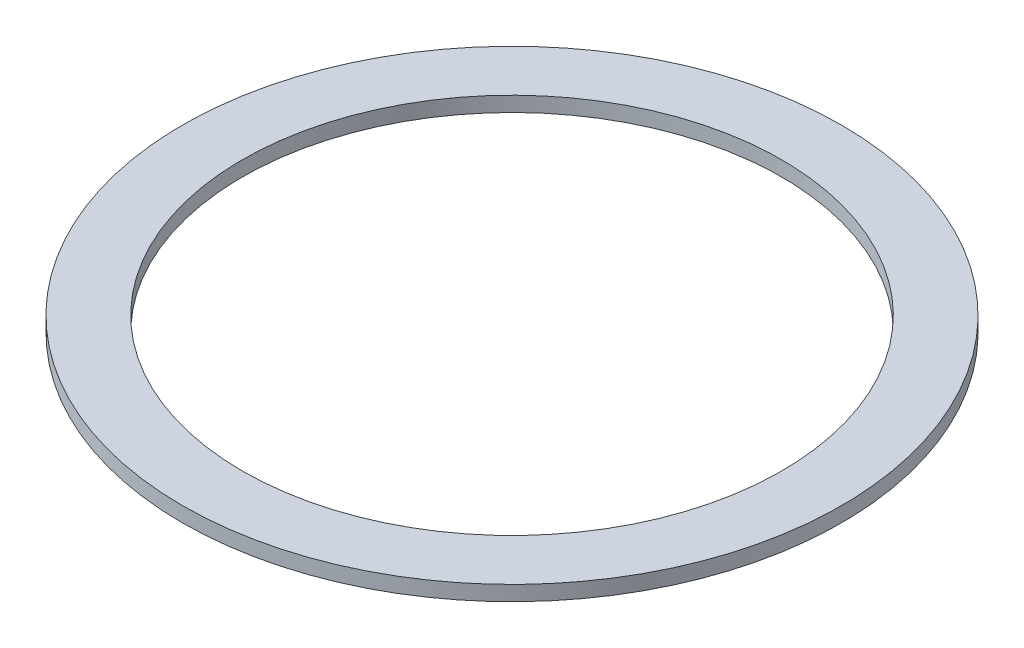
ISO-10303-21;
HEADER;
FILE_DESCRIPTION(('STEP AP214'),'2;1');
FILE_NAME('part.step','',(''),(''),'','','');
FILE_SCHEMA(('AUTOMOTIVE_DESIGN { 1 0 10303 214 1 1 1 1 }'));
ENDSEC;
DATA;
#1=APPLICATION_CONTEXT('core data for automotive mechanical design processes');
#2=APPLICATION_PROTOCOL_DEFINITION('international standard','automotive_design',2000,#1);
#3=PRODUCT_CONTEXT('',#1,'mechanical');
#4=PRODUCT('Part','Part','',(#3));
#5=PRODUCT_RELATED_PRODUCT_CATEGORY('part','',(#4));
#6=PRODUCT_DEFINITION_FORMATION('','',#4);
#7=PRODUCT_DEFINITION_CONTEXT('part definition',#1,'design');
#8=PRODUCT_DEFINITION('design','',#6,#7);
#9=PRODUCT_DEFINITION_SHAPE('','',#8);
#10=(LENGTH_UNIT() NAMED_UNIT(*) SI_UNIT(.MILLI.,.METRE.));
#11=(NAMED_UNIT(*) PLANE_ANGLE_UNIT() SI_UNIT($,.RADIAN.));
#12=(NAMED_UNIT(*) SI_UNIT($,.STERADIAN.) SOLID_ANGLE_UNIT());
#13=UNCERTAINTY_MEASURE_WITH_UNIT(LENGTH_MEASURE(1.E-05),#10,'distance_accuracy_value','');
#14=(GEOMETRIC_REPRESENTATION_CONTEXT(3) GLOBAL_UNCERTAINTY_ASSIGNED_CONTEXT((#13)) GLOBAL_UNIT_ASSIGNED_CONTEXT((#10,
#11,#12)) REPRESENTATION_CONTEXT('',''));
#15=CARTESIAN_POINT('',(0.,0.,0.));
#16=DIRECTION('',(0.,0.,1.));
#17=DIRECTION('',(1.,0.,0.));
#18=AXIS2_PLACEMENT_3D('',#15,#16,#17);
#19=CARTESIAN_POINT('',(0.,3.175,0.));
#20=DIRECTION('',(0.,1.,0.));
#21=DIRECTION('',(0.,0.,1.));
#22=AXIS2_PLACEMENT_3D('',#19,#20,#21);
#23=PLANE('',#22);
#24=CARTESIAN_POINT('',(0.,3.175,0.));
#25=DIRECTION('',(0.,1.,0.));
#26=DIRECTION('',(0.,0.,1.));
#27=AXIS2_PLACEMENT_3D('',#24,#25,#26);
#28=CIRCLE('',#27,69.85);
#29=CARTESIAN_POINT('',(0.,3.175,69.85));
#30=VERTEX_POINT('',#29);
#31=EDGE_CURVE('E10',#30,#30,#28,.T.);
#32=ORIENTED_EDGE('',*,*,#31,.T.);
#33=EDGE_LOOP('',(#32));
#34=FACE_BOUND('',#33,.T.);
#35=CARTESIAN_POINT('',(0.,3.175,0.));
#36=DIRECTION('',(0.,1.,0.));
#37=DIRECTION('',(0.,0.,1.));
#38=AXIS2_PLACEMENT_3D('',#35,#36,#37);
#39=CIRCLE('',#38,57.15);
#40=CARTESIAN_POINT('',(0.,3.175,57.15));
#41=VERTEX_POINT('',#40);
#42=EDGE_CURVE('E42',#41,#41,#39,.T.);
#43=ORIENTED_EDGE('',*,*,#42,.F.);
#44=EDGE_LOOP('',(#43));
#45=FACE_BOUND('',#44,.T.);
#46=ADVANCED_FACE('F31',(#34,#45),#23,.T.);
#47=CARTESIAN_POINT('',(0.,0.,0.));
#48=DIRECTION('',(0.,1.,0.));
#49=DIRECTION('',(0.,0.,1.));
#50=AXIS2_PLACEMENT_3D('',#47,#48,#49);
#51=PLANE('',#50);
#52=CARTESIAN_POINT('',(0.,0.,0.));
#53=DIRECTION('',(0.,1.,0.));
#54=DIRECTION('',(0.,0.,1.));
#55=AXIS2_PLACEMENT_3D('',#52,#53,#54);
#56=CIRCLE('',#55,69.85);
#57=CARTESIAN_POINT('',(0.,0.,69.85));
#58=VERTEX_POINT('',#57);
#59=EDGE_CURVE('E35',#58,#58,#56,.T.);
#60=ORIENTED_EDGE('',*,*,#59,.F.);
#61=EDGE_LOOP('',(#60));
#62=FACE_BOUND('',#61,.T.);
#63=CARTESIAN_POINT('',(0.,0.,0.));
#64=DIRECTION('',(0.,1.,0.));
#65=DIRECTION('',(0.,0.,1.));
#66=AXIS2_PLACEMENT_3D('',#63,#64,#65);
#67=CIRCLE('',#66,57.15);
#68=CARTESIAN_POINT('',(0.,0.,57.15));
#69=VERTEX_POINT('',#68);
#70=EDGE_CURVE('E44',#69,#69,#67,.T.);
#71=ORIENTED_EDGE('',*,*,#70,.T.);
#72=EDGE_LOOP('',(#71));
#73=FACE_BOUND('',#72,.T.);
#74=ADVANCED_FACE('F54',(#62,#73),#51,.F.);
#75=CARTESIAN_POINT('',(0.,3.175,0.));
#76=DIRECTION('',(0.,-1.,0.));
#77=DIRECTION('',(0.,0.,-1.));
#78=AXIS2_PLACEMENT_3D('',#75,#76,#77);
#79=CYLINDRICAL_SURFACE('',#78,69.85);
#80=ORIENTED_EDGE('',*,*,#31,.F.);
#81=EDGE_LOOP('',(#80));
#82=FACE_BOUND('',#81,.T.);
#83=ORIENTED_EDGE('',*,*,#59,.T.);
#84=EDGE_LOOP('',(#83));
#85=FACE_BOUND('',#84,.T.);
#86=ADVANCED_FACE('F33',(#82,#85),#79,.T.);
#87=CARTESIAN_POINT('',(0.,3.175,0.));
#88=DIRECTION('',(0.,-1.,0.));
#89=DIRECTION('',(0.,0.,-1.));
#90=AXIS2_PLACEMENT_3D('',#87,#88,#89);
#91=CYLINDRICAL_SURFACE('',#90,57.15);
#92=ORIENTED_EDGE('',*,*,#42,.T.);
#93=EDGE_LOOP('',(#92));
#94=FACE_BOUND('',#93,.T.);
#95=ORIENTED_EDGE('',*,*,#70,.F.);
#96=EDGE_LOOP('',(#95));
#97=FACE_BOUND('',#96,.T.);
#98=ADVANCED_FACE('F50',(#94,#97),#91,.F.);
#99=CLOSED_SHELL('',(#46,#74,#86,#98));
#100=MANIFOLD_SOLID_BREP('B2',#99);
#101=ADVANCED_BREP_SHAPE_REPRESENTATION('',(#18,#100),#14);
#102=SHAPE_DEFINITION_REPRESENTATION(#9,#101);
ENDSEC;
END-ISO-10303-21;
